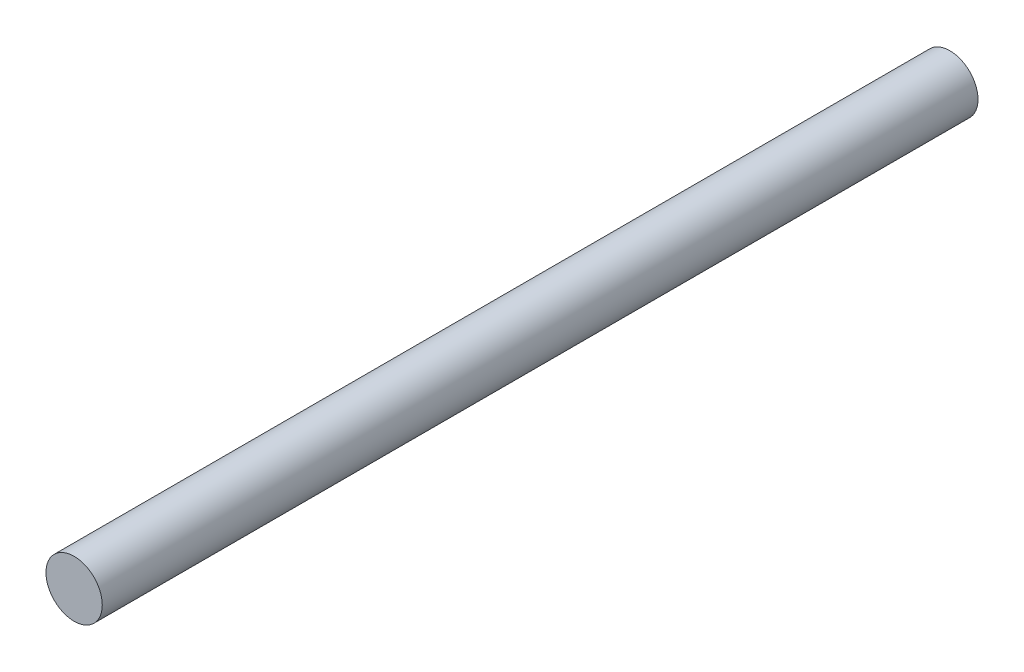
ISO-10303-21;
HEADER;
FILE_DESCRIPTION(('STEP AP214'),'2;1');
FILE_NAME('part.step','',(''),(''),'','','');
FILE_SCHEMA(('AUTOMOTIVE_DESIGN { 1 0 10303 214 1 1 1 1 }'));
ENDSEC;
DATA;
#1=APPLICATION_CONTEXT('core data for automotive mechanical design processes');
#2=APPLICATION_PROTOCOL_DEFINITION('international standard','automotive_design',2000,#1);
#3=PRODUCT_CONTEXT('',#1,'mechanical');
#4=PRODUCT('Part','Part','',(#3));
#5=PRODUCT_RELATED_PRODUCT_CATEGORY('part','',(#4));
#6=PRODUCT_DEFINITION_FORMATION('','',#4);
#7=PRODUCT_DEFINITION_CONTEXT('part definition',#1,'design');
#8=PRODUCT_DEFINITION('design','',#6,#7);
#9=PRODUCT_DEFINITION_SHAPE('','',#8);
#10=(LENGTH_UNIT() NAMED_UNIT(*) SI_UNIT(.MILLI.,.METRE.));
#11=(NAMED_UNIT(*) PLANE_ANGLE_UNIT() SI_UNIT($,.RADIAN.));
#12=(NAMED_UNIT(*) SI_UNIT($,.STERADIAN.) SOLID_ANGLE_UNIT());
#13=UNCERTAINTY_MEASURE_WITH_UNIT(LENGTH_MEASURE(1.E-05),#10,'distance_accuracy_value','');
#14=(GEOMETRIC_REPRESENTATION_CONTEXT(3) GLOBAL_UNCERTAINTY_ASSIGNED_CONTEXT((#13)) GLOBAL_UNIT_ASSIGNED_CONTEXT((#10,
#11,#12)) REPRESENTATION_CONTEXT('',''));
#15=CARTESIAN_POINT('',(0.,0.,0.));
#16=DIRECTION('',(0.,0.,1.));
#17=DIRECTION('',(1.,0.,0.));
#18=AXIS2_PLACEMENT_3D('',#15,#16,#17);
#19=CARTESIAN_POINT('',(0.,0.,-133.2));
#20=DIRECTION('',(0.,0.,1.));
#21=DIRECTION('',(1.,0.,0.));
#22=AXIS2_PLACEMENT_3D('',#19,#20,#21);
#23=CYLINDRICAL_SURFACE('',#22,8.89);
#24=CARTESIAN_POINT('',(0.,0.,-133.2));
#25=DIRECTION('',(0.,0.,1.));
#26=DIRECTION('',(1.,0.,0.));
#27=AXIS2_PLACEMENT_3D('',#24,#25,#26);
#28=CIRCLE('',#27,8.89);
#29=CARTESIAN_POINT('',(8.89,0.,-133.2));
#30=VERTEX_POINT('',#29);
#31=EDGE_CURVE('E10',#30,#30,#28,.T.);
#32=CARTESIAN_POINT('',(0.,0.,143.2));
#33=DIRECTION('',(0.,0.,1.));
#34=DIRECTION('',(1.,0.,0.));
#35=AXIS2_PLACEMENT_3D('',#32,#33,#34);
#36=CIRCLE('',#35,8.89);
#37=CARTESIAN_POINT('',(8.89,0.,143.2));
#38=VERTEX_POINT('',#37);
#39=EDGE_CURVE('E43',#38,#38,#36,.T.);
#40=CARTESIAN_POINT('',(8.89,0.,-133.2));
#41=CARTESIAN_POINT('',(8.89,0.,-130.320833333333));
#42=CARTESIAN_POINT('',(8.89,0.,-127.441666666667));
#43=CARTESIAN_POINT('',(8.89,0.,-121.683333333333));
#44=CARTESIAN_POINT('',(8.89,0.,-118.804166666667));
#45=CARTESIAN_POINT('',(8.89,0.,-113.045833333333));
#46=CARTESIAN_POINT('',(8.89,0.,-110.166666666667));
#47=CARTESIAN_POINT('',(8.89,0.,-104.408333333333));
#48=CARTESIAN_POINT('',(8.89,0.,-101.529166666667));
#49=CARTESIAN_POINT('',(8.89,0.,-95.7708333333333));
#50=CARTESIAN_POINT('',(8.89,0.,-92.8916666666666));
#51=CARTESIAN_POINT('',(8.89,0.,-87.1333333333333));
#52=CARTESIAN_POINT('',(8.89,0.,-84.2541666666666));
#53=CARTESIAN_POINT('',(8.89,0.,-78.4958333333333));
#54=CARTESIAN_POINT('',(8.89,0.,-75.6166666666666));
#55=CARTESIAN_POINT('',(8.89,0.,-69.8583333333333));
#56=CARTESIAN_POINT('',(8.89,0.,-66.9791666666667));
#57=CARTESIAN_POINT('',(8.89,0.,-61.2208333333333));
#58=CARTESIAN_POINT('',(8.89,0.,-58.3416666666667));
#59=CARTESIAN_POINT('',(8.89,0.,-52.5833333333333));
#60=CARTESIAN_POINT('',(8.89,0.,-49.7041666666667));
#61=CARTESIAN_POINT('',(8.89,0.,-43.9458333333333));
#62=CARTESIAN_POINT('',(8.89,0.,-41.0666666666667));
#63=CARTESIAN_POINT('',(8.89,0.,-35.3083333333333));
#64=CARTESIAN_POINT('',(8.89,0.,-32.4291666666667));
#65=CARTESIAN_POINT('',(8.89,0.,-26.6708333333333));
#66=CARTESIAN_POINT('',(8.89,0.,-23.7916666666667));
#67=CARTESIAN_POINT('',(8.89,0.,-18.0333333333333));
#68=CARTESIAN_POINT('',(8.89,0.,-15.1541666666667));
#69=CARTESIAN_POINT('',(8.89,0.,-9.39583333333335));
#70=CARTESIAN_POINT('',(8.89,0.,-6.5166666666667));
#71=CARTESIAN_POINT('',(8.89,0.,-0.758333333333379));
#72=CARTESIAN_POINT('',(8.89,0.,2.12083333333329));
#73=CARTESIAN_POINT('',(8.89,0.,7.87916666666661));
#74=CARTESIAN_POINT('',(8.89,0.,10.7583333333333));
#75=CARTESIAN_POINT('',(8.89,0.,16.5166666666666));
#76=CARTESIAN_POINT('',(8.89,0.,19.3958333333333));
#77=CARTESIAN_POINT('',(8.89,0.,25.1541666666666));
#78=CARTESIAN_POINT('',(8.89,0.,28.0333333333333));
#79=CARTESIAN_POINT('',(8.89,0.,33.7916666666666));
#80=CARTESIAN_POINT('',(8.89,0.,36.6708333333333));
#81=CARTESIAN_POINT('',(8.89,0.,42.4291666666666));
#82=CARTESIAN_POINT('',(8.89,0.,45.3083333333333));
#83=CARTESIAN_POINT('',(8.89,0.,51.0666666666666));
#84=CARTESIAN_POINT('',(8.89,0.,53.9458333333333));
#85=CARTESIAN_POINT('',(8.89,0.,59.7041666666666));
#86=CARTESIAN_POINT('',(8.89,0.,62.5833333333333));
#87=CARTESIAN_POINT('',(8.89,0.,68.3416666666666));
#88=CARTESIAN_POINT('',(8.89,0.,71.2208333333332));
#89=CARTESIAN_POINT('',(8.89,0.,76.9791666666666));
#90=CARTESIAN_POINT('',(8.89,0.,79.8583333333332));
#91=CARTESIAN_POINT('',(8.89,0.,85.6166666666666));
#92=CARTESIAN_POINT('',(8.89,0.,88.4958333333332));
#93=CARTESIAN_POINT('',(8.89,0.,94.2541666666666));
#94=CARTESIAN_POINT('',(8.89,0.,97.1333333333332));
#95=CARTESIAN_POINT('',(8.89,0.,102.891666666667));
#96=CARTESIAN_POINT('',(8.89,0.,105.770833333333));
#97=CARTESIAN_POINT('',(8.89,0.,111.529166666667));
#98=CARTESIAN_POINT('',(8.89,0.,114.408333333333));
#99=CARTESIAN_POINT('',(8.89,0.,120.166666666667));
#100=CARTESIAN_POINT('',(8.89,0.,123.045833333333));
#101=CARTESIAN_POINT('',(8.89,0.,128.804166666667));
#102=CARTESIAN_POINT('',(8.89,0.,131.683333333333));
#103=CARTESIAN_POINT('',(8.89,0.,137.441666666667));
#104=CARTESIAN_POINT('',(8.89,0.,140.320833333333));
#105=CARTESIAN_POINT('',(8.89,0.,143.2));
#106=B_SPLINE_CURVE_WITH_KNOTS('',3,(#40,#41,#42,#43,#44,#45,#46,#47,#48,#49,#50,#51,#52,#53,
#54,#55,#56,#57,#58,#59,#60,#61,#62,#63,#64,#65,#66,#67,#68,#69,#70,#71,#72,#73,#74,#75,#76,#77,
#78,#79,#80,#81,#82,#83,#84,#85,#86,#87,#88,#89,#90,#91,#92,#93,#94,#95,#96,#97,#98,#99,#100,
#101,#102,#103,#104,#105),.UNSPECIFIED.,.F.,.F.,(4,2,2,2,2,2,2,2,2,2,2,2,2,2,2,2,2,2,2,2,2,2,2,
2,2,2,2,2,2,2,2,2,4),(0.,8.63750000000001,17.275,25.9125,34.55,43.1875,51.825,60.4625,69.1,
77.7375,86.375,95.0125,103.65,112.2875,120.925,129.5625,138.2,146.8375,155.475,164.1125,172.75,
181.3875,190.025,198.6625,207.3,215.9375,224.575,233.2125,241.85,250.4875,259.125,267.7625,
276.4),.UNSPECIFIED.);
#107=EDGE_CURVE('BSEAM37',#30,#38,#106,.T.);
#108=ORIENTED_EDGE('',*,*,#31,.T.);
#109=ORIENTED_EDGE('',*,*,#39,.F.);
#110=ORIENTED_EDGE('',*,*,#107,.T.);
#111=ORIENTED_EDGE('',*,*,#107,.F.);
#112=EDGE_LOOP('',(#108,#110,#109,#111));
#113=FACE_BOUND('',#112,.T.);
#114=ADVANCED_FACE('F37',(#113),#23,.T.);
#115=CARTESIAN_POINT('',(0.,0.,-133.2));
#116=DIRECTION('',(0.,0.,1.));
#117=DIRECTION('',(1.,0.,0.));
#118=AXIS2_PLACEMENT_3D('',#115,#116,#117);
#119=PLANE('',#118);
#120=ORIENTED_EDGE('',*,*,#31,.F.);
#121=EDGE_LOOP('',(#120));
#122=FACE_BOUND('',#121,.T.);
#123=ADVANCED_FACE('F52',(#122),#119,.F.);
#124=CARTESIAN_POINT('',(0.,0.,143.2));
#125=DIRECTION('',(0.,0.,1.));
#126=DIRECTION('',(1.,0.,0.));
#127=AXIS2_PLACEMENT_3D('',#124,#125,#126);
#128=PLANE('',#127);
#129=ORIENTED_EDGE('',*,*,#39,.T.);
#130=EDGE_LOOP('',(#129));
#131=FACE_BOUND('',#130,.T.);
#132=ADVANCED_FACE('F49',(#131),#128,.T.);
#133=CLOSED_SHELL('',(#114,#123,#132));
#134=MANIFOLD_SOLID_BREP('B2',#133);
#135=ADVANCED_BREP_SHAPE_REPRESENTATION('',(#18,#134),#14);
#136=SHAPE_DEFINITION_REPRESENTATION(#9,#135);
ENDSEC;
END-ISO-10303-21;
